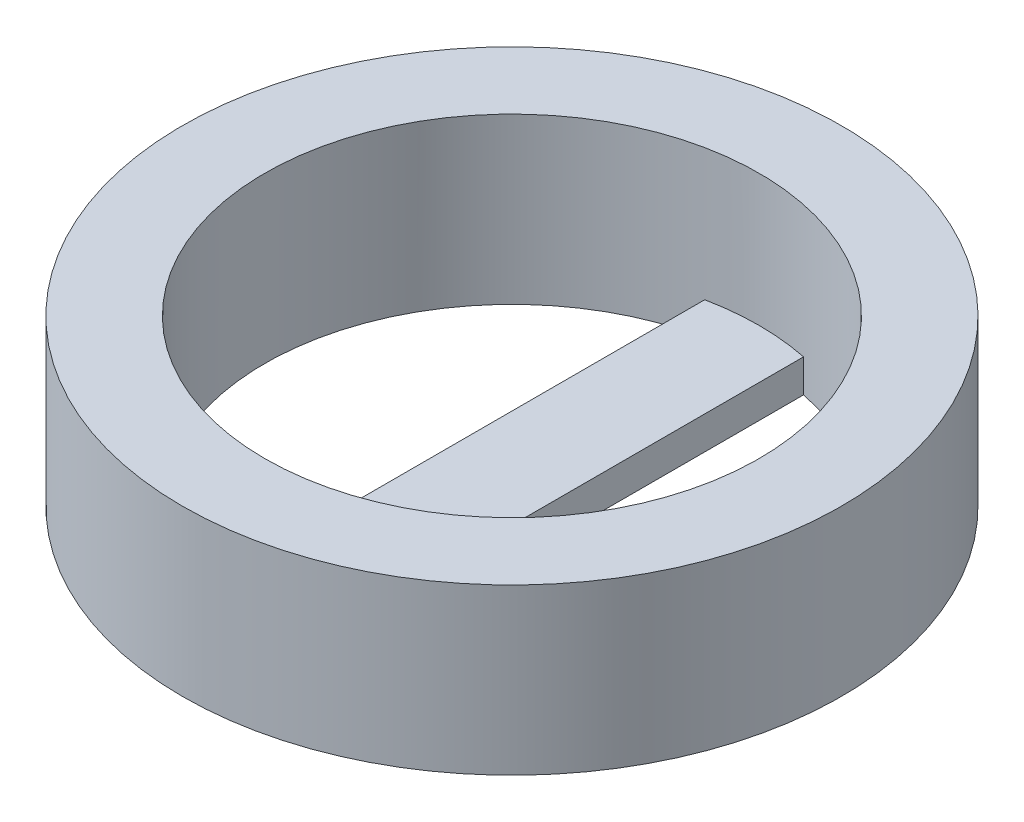
ISO-10303-21;
HEADER;
FILE_DESCRIPTION(('STEP AP214'),'2;1');
FILE_NAME('part.step','',(''),(''),'','','');
FILE_SCHEMA(('AUTOMOTIVE_DESIGN { 1 0 10303 214 1 1 1 1 }'));
ENDSEC;
DATA;
#1=APPLICATION_CONTEXT('core data for automotive mechanical design processes');
#2=APPLICATION_PROTOCOL_DEFINITION('international standard','automotive_design',2000,#1);
#3=PRODUCT_CONTEXT('',#1,'mechanical');
#4=PRODUCT('Part','Part','',(#3));
#5=PRODUCT_RELATED_PRODUCT_CATEGORY('part','',(#4));
#6=PRODUCT_DEFINITION_FORMATION('','',#4);
#7=PRODUCT_DEFINITION_CONTEXT('part definition',#1,'design');
#8=PRODUCT_DEFINITION('design','',#6,#7);
#9=PRODUCT_DEFINITION_SHAPE('','',#8);
#10=(LENGTH_UNIT() NAMED_UNIT(*) SI_UNIT(.MILLI.,.METRE.));
#11=(NAMED_UNIT(*) PLANE_ANGLE_UNIT() SI_UNIT($,.RADIAN.));
#12=(NAMED_UNIT(*) SI_UNIT($,.STERADIAN.) SOLID_ANGLE_UNIT());
#13=UNCERTAINTY_MEASURE_WITH_UNIT(LENGTH_MEASURE(1.E-05),#10,'distance_accuracy_value','');
#14=(GEOMETRIC_REPRESENTATION_CONTEXT(3) GLOBAL_UNCERTAINTY_ASSIGNED_CONTEXT((#13)) GLOBAL_UNIT_ASSIGNED_CONTEXT((#10,
#11,#12)) REPRESENTATION_CONTEXT('',''));
#15=CARTESIAN_POINT('',(0.,0.,0.));
#16=DIRECTION('',(0.,0.,1.));
#17=DIRECTION('',(1.,0.,0.));
#18=AXIS2_PLACEMENT_3D('',#15,#16,#17);
#19=CARTESIAN_POINT('',(0.,5.,0.));
#20=DIRECTION('',(0.,1.,0.));
#21=DIRECTION('',(0.,0.,1.));
#22=AXIS2_PLACEMENT_3D('',#19,#20,#21);
#23=PLANE('',#22);
#24=CARTESIAN_POINT('',(0.,5.,0.));
#25=DIRECTION('',(0.,1.,0.));
#26=DIRECTION('',(0.,0.,1.));
#27=AXIS2_PLACEMENT_3D('',#24,#25,#26);
#28=CIRCLE('',#27,10.);
#29=CARTESIAN_POINT('',(0.,5.,10.));
#30=VERTEX_POINT('',#29);
#31=EDGE_CURVE('E114',#30,#30,#28,.T.);
#32=ORIENTED_EDGE('',*,*,#31,.T.);
#33=EDGE_LOOP('',(#32));
#34=FACE_BOUND('',#33,.T.);
#35=CARTESIAN_POINT('',(0.,5.,0.));
#36=DIRECTION('',(0.,1.,0.));
#37=DIRECTION('',(0.,0.,1.));
#38=AXIS2_PLACEMENT_3D('',#35,#36,#37);
#39=CIRCLE('',#38,7.5);
#40=CARTESIAN_POINT('',(0.,5.,7.5));
#41=VERTEX_POINT('',#40);
#42=EDGE_CURVE('E103',#41,#41,#39,.T.);
#43=ORIENTED_EDGE('',*,*,#42,.F.);
#44=EDGE_LOOP('',(#43));
#45=FACE_BOUND('',#44,.T.);
#46=ADVANCED_FACE('F43',(#34,#45),#23,.T.);
#47=CARTESIAN_POINT('',(0.,0.,0.));
#48=DIRECTION('',(0.,1.,0.));
#49=DIRECTION('',(0.,0.,1.));
#50=AXIS2_PLACEMENT_3D('',#47,#48,#49);
#51=PLANE('',#50);
#52=DIRECTION('',(0.,0.,1.));
#53=VECTOR('',#52,1.);
#54=CARTESIAN_POINT('',(1.5,0.,-7.5));
#55=LINE('',#54,#53);
#56=CARTESIAN_POINT('',(1.5,0.,-7.34846922834953));
#57=VERTEX_POINT('',#56);
#58=CARTESIAN_POINT('',(1.5,0.,7.34846922834953));
#59=VERTEX_POINT('',#58);
#60=EDGE_CURVE('E85',#57,#59,#55,.T.);
#61=ORIENTED_EDGE('',*,*,#60,.T.);
#62=CARTESIAN_POINT('',(0.,0.,0.));
#63=DIRECTION('',(0.,1.,0.));
#64=DIRECTION('',(0.,0.,1.));
#65=AXIS2_PLACEMENT_3D('',#62,#63,#64);
#66=CIRCLE('',#65,7.5);
#67=EDGE_CURVE('E99',#59,#57,#66,.T.);
#68=ORIENTED_EDGE('',*,*,#67,.T.);
#69=EDGE_LOOP('',(#61,#68));
#70=FACE_BOUND('',#69,.T.);
#71=DIRECTION('',(0.,0.,-1.));
#72=VECTOR('',#71,1.);
#73=CARTESIAN_POINT('',(-1.5,0.,-7.5));
#74=LINE('',#73,#72);
#75=CARTESIAN_POINT('',(-1.5,0.,7.34846922834953));
#76=VERTEX_POINT('',#75);
#77=CARTESIAN_POINT('',(-1.5,0.,-7.34846922834953));
#78=VERTEX_POINT('',#77);
#79=EDGE_CURVE('E58',#76,#78,#74,.T.);
#80=ORIENTED_EDGE('',*,*,#79,.T.);
#81=EDGE_CURVE('E104',#78,#76,#66,.T.);
#82=ORIENTED_EDGE('',*,*,#81,.T.);
#83=EDGE_LOOP('',(#80,#82));
#84=FACE_BOUND('',#83,.T.);
#85=CARTESIAN_POINT('',(0.,0.,0.));
#86=DIRECTION('',(0.,1.,0.));
#87=DIRECTION('',(0.,0.,1.));
#88=AXIS2_PLACEMENT_3D('',#85,#86,#87);
#89=CIRCLE('',#88,10.);
#90=CARTESIAN_POINT('',(0.,0.,10.));
#91=VERTEX_POINT('',#90);
#92=EDGE_CURVE('E109',#91,#91,#89,.T.);
#93=ORIENTED_EDGE('',*,*,#92,.F.);
#94=EDGE_LOOP('',(#93));
#95=FACE_BOUND('',#94,.T.);
#96=ADVANCED_FACE('F101',(#70,#84,#95),#51,.F.);
#97=CARTESIAN_POINT('',(0.,5.,0.));
#98=DIRECTION('',(0.,-1.,0.));
#99=DIRECTION('',(0.,0.,-1.));
#100=AXIS2_PLACEMENT_3D('',#97,#98,#99);
#101=CYLINDRICAL_SURFACE('',#100,10.);
#102=ORIENTED_EDGE('',*,*,#31,.F.);
#103=EDGE_LOOP('',(#102));
#104=FACE_BOUND('',#103,.T.);
#105=ORIENTED_EDGE('',*,*,#92,.T.);
#106=EDGE_LOOP('',(#105));
#107=FACE_BOUND('',#106,.T.);
#108=ADVANCED_FACE('F45',(#104,#107),#101,.T.);
#109=CARTESIAN_POINT('',(0.,5.,0.));
#110=DIRECTION('',(0.,-1.,0.));
#111=DIRECTION('',(0.,0.,-1.));
#112=AXIS2_PLACEMENT_3D('',#109,#110,#111);
#113=CYLINDRICAL_SURFACE('',#112,7.5);
#114=DIRECTION('',(0.,-1.,0.));
#115=VECTOR('',#114,1.);
#116=CARTESIAN_POINT('',(1.5,5.,-7.34846922834953));
#117=LINE('',#116,#115);
#118=CARTESIAN_POINT('',(1.5,1.,-7.34846922834953));
#119=VERTEX_POINT('',#118);
#120=EDGE_CURVE('E11',#57,#119,#117,.F.);
#121=ORIENTED_EDGE('',*,*,#120,.F.);
#122=ORIENTED_EDGE('',*,*,#67,.F.);
#123=DIRECTION('',(0.,-1.,0.));
#124=VECTOR('',#123,1.);
#125=CARTESIAN_POINT('',(1.5,5.,7.34846922834953));
#126=LINE('',#125,#124);
#127=CARTESIAN_POINT('',(1.5,1.,7.34846922834953));
#128=VERTEX_POINT('',#127);
#129=EDGE_CURVE('E90',#128,#59,#126,.T.);
#130=ORIENTED_EDGE('',*,*,#129,.F.);
#131=CARTESIAN_POINT('',(0.,1.,0.));
#132=DIRECTION('',(0.,1.,0.));
#133=DIRECTION('',(0.,0.,1.));
#134=AXIS2_PLACEMENT_3D('',#131,#132,#133);
#135=CIRCLE('',#134,7.5);
#136=CARTESIAN_POINT('',(-1.5,1.,7.34846922834953));
#137=VERTEX_POINT('',#136);
#138=EDGE_CURVE('E118',#137,#128,#135,.T.);
#139=ORIENTED_EDGE('',*,*,#138,.F.);
#140=DIRECTION('',(0.,-1.,0.));
#141=VECTOR('',#140,1.);
#142=CARTESIAN_POINT('',(-1.5,5.,7.34846922834953));
#143=LINE('',#142,#141);
#144=EDGE_CURVE('E124',#76,#137,#143,.F.);
#145=ORIENTED_EDGE('',*,*,#144,.F.);
#146=ORIENTED_EDGE('',*,*,#81,.F.);
#147=DIRECTION('',(0.,-1.,0.));
#148=VECTOR('',#147,1.);
#149=CARTESIAN_POINT('',(-1.5,5.,-7.34846922834953));
#150=LINE('',#149,#148);
#151=CARTESIAN_POINT('',(-1.5,1.,-7.34846922834953));
#152=VERTEX_POINT('',#151);
#153=EDGE_CURVE('E52',#152,#78,#150,.T.);
#154=ORIENTED_EDGE('',*,*,#153,.F.);
#155=EDGE_CURVE('E66',#119,#152,#135,.T.);
#156=ORIENTED_EDGE('',*,*,#155,.F.);
#157=EDGE_LOOP('',(#121,#122,#130,#139,#145,#146,#154,#156));
#158=FACE_BOUND('',#157,.T.);
#159=ORIENTED_EDGE('',*,*,#42,.T.);
#160=EDGE_LOOP('',(#159));
#161=FACE_BOUND('',#160,.T.);
#162=ADVANCED_FACE('F97',(#158,#161),#113,.F.);
#163=CARTESIAN_POINT('',(0.,1.,0.));
#164=DIRECTION('',(0.,1.,0.));
#165=DIRECTION('',(0.,0.,1.));
#166=AXIS2_PLACEMENT_3D('',#163,#164,#165);
#167=PLANE('',#166);
#168=DIRECTION('',(0.,0.,1.));
#169=VECTOR('',#168,1.);
#170=CARTESIAN_POINT('',(1.5,1.,-7.5));
#171=LINE('',#170,#169);
#172=EDGE_CURVE('E161',#119,#128,#171,.T.);
#173=ORIENTED_EDGE('',*,*,#172,.F.);
#174=ORIENTED_EDGE('',*,*,#155,.T.);
#175=DIRECTION('',(0.,0.,-1.));
#176=VECTOR('',#175,1.);
#177=CARTESIAN_POINT('',(-1.5,1.,-7.5));
#178=LINE('',#177,#176);
#179=EDGE_CURVE('E111',#137,#152,#178,.T.);
#180=ORIENTED_EDGE('',*,*,#179,.F.);
#181=ORIENTED_EDGE('',*,*,#138,.T.);
#182=EDGE_LOOP('',(#173,#174,#180,#181));
#183=FACE_BOUND('',#182,.T.);
#184=ADVANCED_FACE('F144',(#183),#167,.T.);
#185=CARTESIAN_POINT('',(1.5,1.,-7.5));
#186=DIRECTION('',(1.,0.,0.));
#187=DIRECTION('',(0.,0.,-1.));
#188=AXIS2_PLACEMENT_3D('',#185,#186,#187);
#189=PLANE('',#188);
#190=ORIENTED_EDGE('',*,*,#172,.T.);
#191=ORIENTED_EDGE('',*,*,#129,.T.);
#192=ORIENTED_EDGE('',*,*,#60,.F.);
#193=ORIENTED_EDGE('',*,*,#120,.T.);
#194=EDGE_LOOP('',(#190,#191,#192,#193));
#195=FACE_BOUND('',#194,.T.);
#196=ADVANCED_FACE('F88',(#195),#189,.T.);
#197=CARTESIAN_POINT('',(-1.5,1.,-7.5));
#198=DIRECTION('',(-1.,0.,0.));
#199=DIRECTION('',(0.,0.,1.));
#200=AXIS2_PLACEMENT_3D('',#197,#198,#199);
#201=PLANE('',#200);
#202=ORIENTED_EDGE('',*,*,#179,.T.);
#203=ORIENTED_EDGE('',*,*,#153,.T.);
#204=ORIENTED_EDGE('',*,*,#79,.F.);
#205=ORIENTED_EDGE('',*,*,#144,.T.);
#206=EDGE_LOOP('',(#202,#203,#204,#205));
#207=FACE_BOUND('',#206,.T.);
#208=ADVANCED_FACE('F132',(#207),#201,.T.);
#209=CLOSED_SHELL('',(#46,#96,#108,#162,#184,#196,#208));
#210=MANIFOLD_SOLID_BREP('B2',#209);
#211=ADVANCED_BREP_SHAPE_REPRESENTATION('',(#18,#210),#14);
#212=SHAPE_DEFINITION_REPRESENTATION(#9,#211);
ENDSEC;
END-ISO-10303-21;
